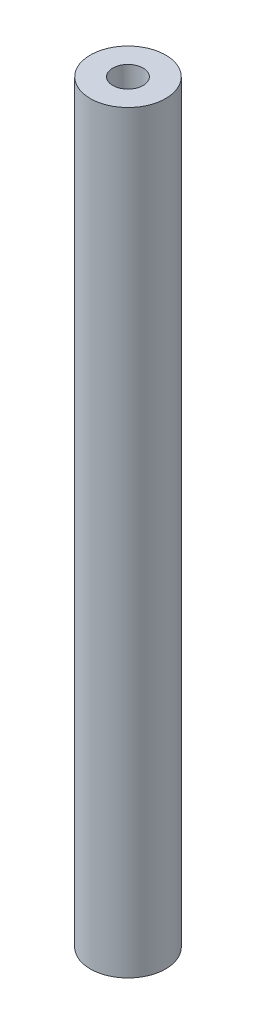
ISO-10303-21;
HEADER;
FILE_DESCRIPTION(('STEP AP214'),'2;1');
FILE_NAME('part.step','',(''),(''),'','','');
FILE_SCHEMA(('AUTOMOTIVE_DESIGN { 1 0 10303 214 1 1 1 1 }'));
ENDSEC;
DATA;
#1=APPLICATION_CONTEXT('core data for automotive mechanical design processes');
#2=APPLICATION_PROTOCOL_DEFINITION('international standard','automotive_design',2000,#1);
#3=PRODUCT_CONTEXT('',#1,'mechanical');
#4=PRODUCT('Part','Part','',(#3));
#5=PRODUCT_RELATED_PRODUCT_CATEGORY('part','',(#4));
#6=PRODUCT_DEFINITION_FORMATION('','',#4);
#7=PRODUCT_DEFINITION_CONTEXT('part definition',#1,'design');
#8=PRODUCT_DEFINITION('design','',#6,#7);
#9=PRODUCT_DEFINITION_SHAPE('','',#8);
#10=(LENGTH_UNIT() NAMED_UNIT(*) SI_UNIT(.MILLI.,.METRE.));
#11=(NAMED_UNIT(*) PLANE_ANGLE_UNIT() SI_UNIT($,.RADIAN.));
#12=(NAMED_UNIT(*) SI_UNIT($,.STERADIAN.) SOLID_ANGLE_UNIT());
#13=UNCERTAINTY_MEASURE_WITH_UNIT(LENGTH_MEASURE(1.E-05),#10,'distance_accuracy_value','');
#14=(GEOMETRIC_REPRESENTATION_CONTEXT(3) GLOBAL_UNCERTAINTY_ASSIGNED_CONTEXT((#13)) GLOBAL_UNIT_ASSIGNED_CONTEXT((#10,
#11,#12)) REPRESENTATION_CONTEXT('',''));
#15=CARTESIAN_POINT('',(0.,0.,0.));
#16=DIRECTION('',(0.,0.,1.));
#17=DIRECTION('',(1.,0.,0.));
#18=AXIS2_PLACEMENT_3D('',#15,#16,#17);
#19=CARTESIAN_POINT('',(0.,127.,0.));
#20=DIRECTION('',(0.,-1.,0.));
#21=DIRECTION('',(0.,0.,-1.));
#22=AXIS2_PLACEMENT_3D('',#19,#20,#21);
#23=CYLINDRICAL_SURFACE('',#22,6.35);
#24=CARTESIAN_POINT('',(0.,127.,0.));
#25=DIRECTION('',(0.,1.,0.));
#26=DIRECTION('',(0.,0.,1.));
#27=AXIS2_PLACEMENT_3D('',#24,#25,#26);
#28=CIRCLE('',#27,6.35);
#29=CARTESIAN_POINT('',(0.,127.,6.35));
#30=VERTEX_POINT('',#29);
#31=EDGE_CURVE('E11',#30,#30,#28,.T.);
#32=ORIENTED_EDGE('',*,*,#31,.F.);
#33=EDGE_LOOP('',(#32));
#34=FACE_BOUND('',#33,.T.);
#35=CARTESIAN_POINT('',(0.,0.,0.));
#36=DIRECTION('',(0.,1.,0.));
#37=DIRECTION('',(0.,0.,1.));
#38=AXIS2_PLACEMENT_3D('',#35,#36,#37);
#39=CIRCLE('',#38,6.35);
#40=CARTESIAN_POINT('',(0.,0.,6.35));
#41=VERTEX_POINT('',#40);
#42=EDGE_CURVE('E36',#41,#41,#39,.T.);
#43=ORIENTED_EDGE('',*,*,#42,.T.);
#44=EDGE_LOOP('',(#43));
#45=FACE_BOUND('',#44,.T.);
#46=ADVANCED_FACE('F33',(#34,#45),#23,.T.);
#47=CARTESIAN_POINT('',(0.,127.,0.));
#48=DIRECTION('',(0.,1.,0.));
#49=DIRECTION('',(0.,0.,1.));
#50=AXIS2_PLACEMENT_3D('',#47,#48,#49);
#51=PLANE('',#50);
#52=CARTESIAN_POINT('',(0.,127.,0.));
#53=DIRECTION('',(0.,1.,0.));
#54=DIRECTION('',(0.,0.,1.));
#55=AXIS2_PLACEMENT_3D('',#52,#53,#54);
#56=CIRCLE('',#55,2.55269999999999);
#57=CARTESIAN_POINT('',(0.,127.,2.55269999999999));
#58=VERTEX_POINT('',#57);
#59=EDGE_CURVE('E56',#58,#58,#56,.T.);
#60=ORIENTED_EDGE('',*,*,#59,.F.);
#61=EDGE_LOOP('',(#60));
#62=FACE_BOUND('',#61,.T.);
#63=ORIENTED_EDGE('',*,*,#31,.T.);
#64=EDGE_LOOP('',(#63));
#65=FACE_BOUND('',#64,.T.);
#66=ADVANCED_FACE('F75',(#62,#65),#51,.T.);
#67=CARTESIAN_POINT('',(0.,0.,0.));
#68=DIRECTION('',(0.,1.,0.));
#69=DIRECTION('',(0.,0.,1.));
#70=AXIS2_PLACEMENT_3D('',#67,#68,#69);
#71=PLANE('',#70);
#72=CARTESIAN_POINT('',(0.,0.,0.));
#73=DIRECTION('',(0.,-1.,0.));
#74=DIRECTION('',(0.,0.,-1.));
#75=AXIS2_PLACEMENT_3D('',#72,#73,#74);
#76=CIRCLE('',#75,2.55269999999999);
#77=CARTESIAN_POINT('',(0.,0.,-2.55269999999999));
#78=VERTEX_POINT('',#77);
#79=EDGE_CURVE('E57',#78,#78,#76,.T.);
#80=ORIENTED_EDGE('',*,*,#79,.F.);
#81=EDGE_LOOP('',(#80));
#82=FACE_BOUND('',#81,.T.);
#83=ORIENTED_EDGE('',*,*,#42,.F.);
#84=EDGE_LOOP('',(#83));
#85=FACE_BOUND('',#84,.T.);
#86=ADVANCED_FACE('F72',(#82,#85),#71,.F.);
#87=CARTESIAN_POINT('',(0.,110.49,0.));
#88=DIRECTION('',(0.,1.,0.));
#89=DIRECTION('',(0.,0.,1.));
#90=AXIS2_PLACEMENT_3D('',#87,#88,#89);
#91=CONICAL_SURFACE('',#90,2.55269999999999,1.02974425867665);
#92=CARTESIAN_POINT('',(0.,108.956183097808,0.));
#93=VERTEX_POINT('',#92);
#94=VERTEX_LOOP('',#93);
#95=FACE_BOUND('',#94,.T.);
#96=CARTESIAN_POINT('',(0.,110.49,0.));
#97=DIRECTION('',(0.,1.,0.));
#98=DIRECTION('',(0.,0.,1.));
#99=AXIS2_PLACEMENT_3D('',#96,#97,#98);
#100=CIRCLE('',#99,2.55269999999999);
#101=CARTESIAN_POINT('',(0.,110.49,2.55269999999999));
#102=VERTEX_POINT('',#101);
#103=EDGE_CURVE('E60',#102,#102,#100,.T.);
#104=ORIENTED_EDGE('',*,*,#103,.T.);
#105=EDGE_LOOP('',(#104));
#106=FACE_BOUND('',#105,.T.);
#107=ADVANCED_FACE('F74',(#95,#106),#91,.F.);
#108=CARTESIAN_POINT('',(0.,127.,0.));
#109=DIRECTION('',(0.,1.,0.));
#110=DIRECTION('',(0.,0.,1.));
#111=AXIS2_PLACEMENT_3D('',#108,#109,#110);
#112=CYLINDRICAL_SURFACE('',#111,2.55269999999999);
#113=ORIENTED_EDGE('',*,*,#103,.F.);
#114=EDGE_LOOP('',(#113));
#115=FACE_BOUND('',#114,.T.);
#116=ORIENTED_EDGE('',*,*,#59,.T.);
#117=EDGE_LOOP('',(#116));
#118=FACE_BOUND('',#117,.T.);
#119=ADVANCED_FACE('F50',(#115,#118),#112,.F.);
#120=CARTESIAN_POINT('',(0.,16.51,0.));
#121=DIRECTION('',(0.,-1.,0.));
#122=DIRECTION('',(0.,0.,-1.));
#123=AXIS2_PLACEMENT_3D('',#120,#121,#122);
#124=CONICAL_SURFACE('',#123,2.55269999999999,1.02974425867665);
#125=CARTESIAN_POINT('',(0.,18.0438169021916,0.));
#126=VERTEX_POINT('',#125);
#127=VERTEX_LOOP('',#126);
#128=FACE_BOUND('',#127,.T.);
#129=CARTESIAN_POINT('',(0.,16.51,0.));
#130=DIRECTION('',(0.,-1.,0.));
#131=DIRECTION('',(0.,0.,-1.));
#132=AXIS2_PLACEMENT_3D('',#129,#130,#131);
#133=CIRCLE('',#132,2.55269999999999);
#134=CARTESIAN_POINT('',(0.,16.51,-2.55269999999999));
#135=VERTEX_POINT('',#134);
#136=EDGE_CURVE('E54',#135,#135,#133,.T.);
#137=ORIENTED_EDGE('',*,*,#136,.T.);
#138=EDGE_LOOP('',(#137));
#139=FACE_BOUND('',#138,.T.);
#140=ADVANCED_FACE('F46',(#128,#139),#124,.F.);
#141=CARTESIAN_POINT('',(0.,0.,0.));
#142=DIRECTION('',(0.,-1.,0.));
#143=DIRECTION('',(0.,0.,-1.));
#144=AXIS2_PLACEMENT_3D('',#141,#142,#143);
#145=CYLINDRICAL_SURFACE('',#144,2.55269999999999);
#146=ORIENTED_EDGE('',*,*,#136,.F.);
#147=EDGE_LOOP('',(#146));
#148=FACE_BOUND('',#147,.T.);
#149=ORIENTED_EDGE('',*,*,#79,.T.);
#150=EDGE_LOOP('',(#149));
#151=FACE_BOUND('',#150,.T.);
#152=ADVANCED_FACE('F49',(#148,#151),#145,.F.);
#153=CLOSED_SHELL('',(#46,#66,#86,#107,#119,#140,#152));
#154=MANIFOLD_SOLID_BREP('B2',#153);
#155=ADVANCED_BREP_SHAPE_REPRESENTATION('',(#18,#154),#14);
#156=SHAPE_DEFINITION_REPRESENTATION(#9,#155);
ENDSEC;
END-ISO-10303-21;
